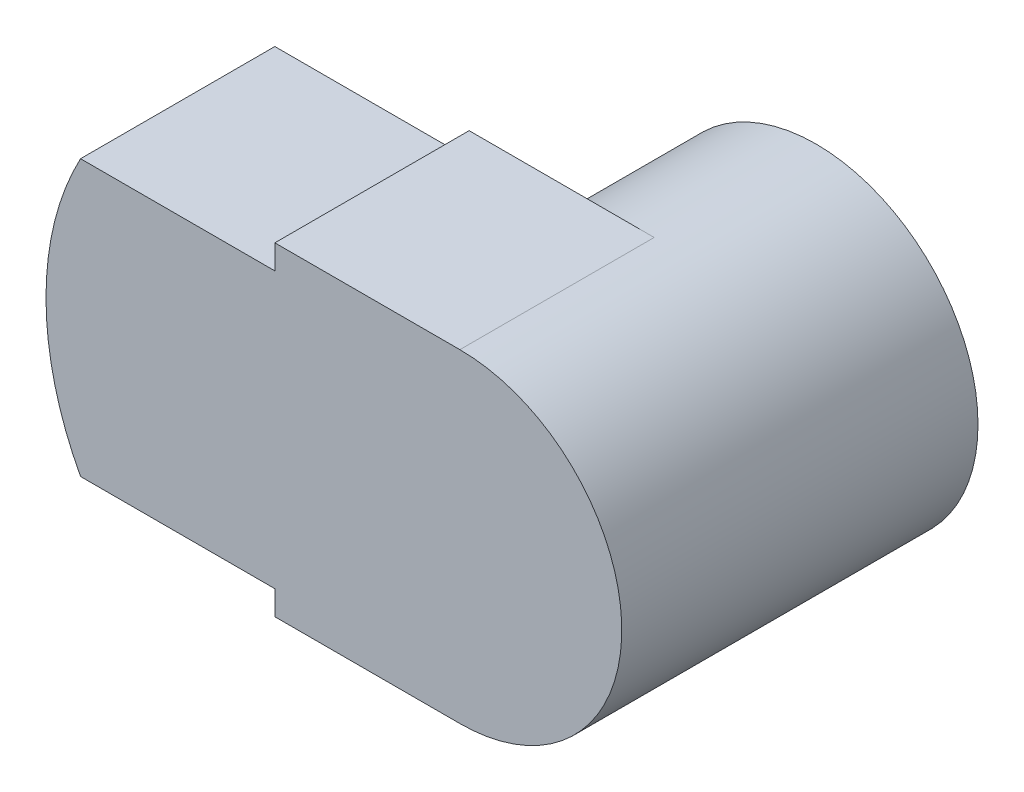
ISO-10303-21;
HEADER;
FILE_DESCRIPTION(('STEP AP214'),'2;1');
FILE_NAME('part.step','',(''),(''),'','','');
FILE_SCHEMA(('AUTOMOTIVE_DESIGN { 1 0 10303 214 1 1 1 1 }'));
ENDSEC;
DATA;
#1=APPLICATION_CONTEXT('core data for automotive mechanical design processes');
#2=APPLICATION_PROTOCOL_DEFINITION('international standard','automotive_design',2000,#1);
#3=PRODUCT_CONTEXT('',#1,'mechanical');
#4=PRODUCT('Part','Part','',(#3));
#5=PRODUCT_RELATED_PRODUCT_CATEGORY('part','',(#4));
#6=PRODUCT_DEFINITION_FORMATION('','',#4);
#7=PRODUCT_DEFINITION_CONTEXT('part definition',#1,'design');
#8=PRODUCT_DEFINITION('design','',#6,#7);
#9=PRODUCT_DEFINITION_SHAPE('','',#8);
#10=(LENGTH_UNIT() NAMED_UNIT(*) SI_UNIT(.MILLI.,.METRE.));
#11=(NAMED_UNIT(*) PLANE_ANGLE_UNIT() SI_UNIT($,.RADIAN.));
#12=(NAMED_UNIT(*) SI_UNIT($,.STERADIAN.) SOLID_ANGLE_UNIT());
#13=UNCERTAINTY_MEASURE_WITH_UNIT(LENGTH_MEASURE(1.E-05),#10,'distance_accuracy_value','');
#14=(GEOMETRIC_REPRESENTATION_CONTEXT(3) GLOBAL_UNCERTAINTY_ASSIGNED_CONTEXT((#13)) GLOBAL_UNIT_ASSIGNED_CONTEXT((#10,
#11,#12)) REPRESENTATION_CONTEXT('',''));
#15=CARTESIAN_POINT('',(0.,0.,0.));
#16=DIRECTION('',(0.,0.,1.));
#17=DIRECTION('',(1.,0.,0.));
#18=AXIS2_PLACEMENT_3D('',#15,#16,#17);
#19=CARTESIAN_POINT('',(-7.56652598149808,0.,22.));
#20=DIRECTION('',(0.,0.,-1.));
#21=DIRECTION('',(-1.,0.,0.));
#22=AXIS2_PLACEMENT_3D('',#19,#20,#21);
#23=CYLINDRICAL_SURFACE('',#22,17.9953141928283);
#24=CARTESIAN_POINT('',(-7.56652598149808,0.,10.));
#25=DIRECTION('',(0.,0.,1.));
#26=DIRECTION('',(1.,0.,0.));
#27=AXIS2_PLACEMENT_3D('',#24,#25,#26);
#28=CIRCLE('',#27,17.9953141928283);
#29=CARTESIAN_POINT('',(-23.4278415920837,8.49999999999999,10.));
#30=VERTEX_POINT('',#29);
#31=CARTESIAN_POINT('',(-23.4278415920837,-8.5,10.));
#32=VERTEX_POINT('',#31);
#33=EDGE_CURVE('E252',#30,#32,#28,.T.);
#34=ORIENTED_EDGE('',*,*,#33,.T.);
#35=DIRECTION('',(0.,0.,-1.));
#36=VECTOR('',#35,1.);
#37=CARTESIAN_POINT('',(-23.4278415920837,-8.5,22.));
#38=LINE('',#37,#36);
#39=CARTESIAN_POINT('',(-23.4278415920837,-8.5,22.));
#40=VERTEX_POINT('',#39);
#41=EDGE_CURVE('E267',#40,#32,#38,.T.);
#42=ORIENTED_EDGE('',*,*,#41,.F.);
#43=CARTESIAN_POINT('',(-7.56652598149808,0.,22.));
#44=DIRECTION('',(0.,0.,1.));
#45=DIRECTION('',(1.,0.,0.));
#46=AXIS2_PLACEMENT_3D('',#43,#44,#45);
#47=CIRCLE('',#46,17.9953141928283);
#48=CARTESIAN_POINT('',(-23.4278415920837,8.49999999999999,22.));
#49=VERTEX_POINT('',#48);
#50=EDGE_CURVE('E235',#49,#40,#47,.T.);
#51=ORIENTED_EDGE('',*,*,#50,.F.);
#52=DIRECTION('',(0.,0.,-1.));
#53=VECTOR('',#52,1.);
#54=CARTESIAN_POINT('',(-23.4278415920837,8.49999999999999,22.));
#55=LINE('',#54,#53);
#56=EDGE_CURVE('E269',#49,#30,#55,.T.);
#57=ORIENTED_EDGE('',*,*,#56,.T.);
#58=EDGE_LOOP('',(#34,#42,#51,#57));
#59=FACE_BOUND('',#58,.T.);
#60=CARTESIAN_POINT('',(-7.56652598149808,0.,11.));
#61=DIRECTION('',(0.,0.,1.));
#62=DIRECTION('',(1.,0.,0.));
#63=AXIS2_PLACEMENT_3D('',#60,#61,#62);
#64=CIRCLE('',#63,17.9953141928283);
#65=CARTESIAN_POINT('',(-23.9244394455866,7.49999999999999,11.));
#66=VERTEX_POINT('',#65);
#67=CARTESIAN_POINT('',(-23.9244394455866,-7.5,11.));
#68=VERTEX_POINT('',#67);
#69=EDGE_CURVE('E196',#66,#68,#64,.T.);
#70=ORIENTED_EDGE('',*,*,#69,.F.);
#71=DIRECTION('',(0.,0.,-1.));
#72=VECTOR('',#71,1.);
#73=CARTESIAN_POINT('',(-23.9244394455866,7.49999999999999,21.));
#74=LINE('',#73,#72);
#75=CARTESIAN_POINT('',(-23.9244394455866,7.49999999999999,21.));
#76=VERTEX_POINT('',#75);
#77=EDGE_CURVE('E204',#76,#66,#74,.T.);
#78=ORIENTED_EDGE('',*,*,#77,.F.);
#79=CARTESIAN_POINT('',(-7.56652598149808,0.,21.));
#80=DIRECTION('',(0.,0.,1.));
#81=DIRECTION('',(1.,0.,0.));
#82=AXIS2_PLACEMENT_3D('',#79,#80,#81);
#83=CIRCLE('',#82,17.9953141928283);
#84=CARTESIAN_POINT('',(-23.9244394455866,-7.5,21.));
#85=VERTEX_POINT('',#84);
#86=EDGE_CURVE('E51',#76,#85,#83,.T.);
#87=ORIENTED_EDGE('',*,*,#86,.T.);
#88=DIRECTION('',(0.,0.,-1.));
#89=VECTOR('',#88,1.);
#90=CARTESIAN_POINT('',(-23.9244394455866,-7.5,21.));
#91=LINE('',#90,#89);
#92=EDGE_CURVE('E217',#85,#68,#91,.T.);
#93=ORIENTED_EDGE('',*,*,#92,.T.);
#94=EDGE_LOOP('',(#70,#78,#87,#93));
#95=FACE_BOUND('',#94,.T.);
#96=ADVANCED_FACE('F36',(#59,#95),#23,.T.);
#97=CARTESIAN_POINT('',(0.,0.,10.));
#98=DIRECTION('',(0.,0.,-1.));
#99=DIRECTION('',(-1.,0.,0.));
#100=AXIS2_PLACEMENT_3D('',#97,#98,#99);
#101=CYLINDRICAL_SURFACE('',#100,10.);
#102=CARTESIAN_POINT('',(0.,0.,10.));
#103=DIRECTION('',(0.,0.,1.));
#104=DIRECTION('',(1.,0.,0.));
#105=AXIS2_PLACEMENT_3D('',#102,#103,#104);
#106=CIRCLE('',#105,10.);
#107=CARTESIAN_POINT('',(0.,10.,10.));
#108=VERTEX_POINT('',#107);
#109=CARTESIAN_POINT('',(0.,-10.,10.));
#110=VERTEX_POINT('',#109);
#111=EDGE_CURVE('E11',#108,#110,#106,.T.);
#112=ORIENTED_EDGE('',*,*,#111,.F.);
#113=DIRECTION('',(0.,0.,-1.));
#114=VECTOR('',#113,1.);
#115=CARTESIAN_POINT('',(0.,10.,22.));
#116=LINE('',#115,#114);
#117=CARTESIAN_POINT('',(0.,10.,22.));
#118=VERTEX_POINT('',#117);
#119=EDGE_CURVE('E278',#118,#108,#116,.T.);
#120=ORIENTED_EDGE('',*,*,#119,.F.);
#121=CARTESIAN_POINT('',(0.,0.,22.));
#122=DIRECTION('',(0.,0.,1.));
#123=DIRECTION('',(1.,0.,0.));
#124=AXIS2_PLACEMENT_3D('',#121,#122,#123);
#125=CIRCLE('',#124,10.);
#126=CARTESIAN_POINT('',(0.,-10.,22.));
#127=VERTEX_POINT('',#126);
#128=EDGE_CURVE('E225',#127,#118,#125,.T.);
#129=ORIENTED_EDGE('',*,*,#128,.F.);
#130=DIRECTION('',(0.,0.,-1.));
#131=VECTOR('',#130,1.);
#132=CARTESIAN_POINT('',(0.,-10.,22.));
#133=LINE('',#132,#131);
#134=EDGE_CURVE('E246',#127,#110,#133,.T.);
#135=ORIENTED_EDGE('',*,*,#134,.T.);
#136=EDGE_LOOP('',(#112,#120,#129,#135));
#137=FACE_BOUND('',#136,.T.);
#138=CARTESIAN_POINT('',(0.,0.,0.));
#139=DIRECTION('',(0.,0.,1.));
#140=DIRECTION('',(1.,0.,0.));
#141=AXIS2_PLACEMENT_3D('',#138,#139,#140);
#142=CIRCLE('',#141,10.);
#143=CARTESIAN_POINT('',(10.,0.,0.));
#144=VERTEX_POINT('',#143);
#145=EDGE_CURVE('E40',#144,#144,#142,.T.);
#146=ORIENTED_EDGE('',*,*,#145,.T.);
#147=EDGE_LOOP('',(#146));
#148=FACE_BOUND('',#147,.T.);
#149=ADVANCED_FACE('F38',(#137,#148),#101,.T.);
#150=CARTESIAN_POINT('',(0.,0.,0.));
#151=DIRECTION('',(0.,0.,1.));
#152=DIRECTION('',(1.,0.,0.));
#153=AXIS2_PLACEMENT_3D('',#150,#151,#152);
#154=PLANE('',#153);
#155=ORIENTED_EDGE('',*,*,#145,.F.);
#156=EDGE_LOOP('',(#155));
#157=FACE_BOUND('',#156,.T.);
#158=ADVANCED_FACE('F286',(#157),#154,.F.);
#159=CARTESIAN_POINT('',(0.,0.,10.));
#160=DIRECTION('',(0.,0.,1.));
#161=DIRECTION('',(1.,0.,0.));
#162=AXIS2_PLACEMENT_3D('',#159,#160,#161);
#163=PLANE('',#162);
#164=DIRECTION('',(-1.,0.,0.));
#165=VECTOR('',#164,1.);
#166=CARTESIAN_POINT('',(0.,10.,10.));
#167=LINE('',#166,#165);
#168=CARTESIAN_POINT('',(-11.4278415920837,10.,10.));
#169=VERTEX_POINT('',#168);
#170=EDGE_CURVE('E160',#108,#169,#167,.T.);
#171=ORIENTED_EDGE('',*,*,#170,.F.);
#172=ORIENTED_EDGE('',*,*,#111,.T.);
#173=DIRECTION('',(-1.,0.,0.));
#174=VECTOR('',#173,1.);
#175=CARTESIAN_POINT('',(0.,-10.,10.));
#176=LINE('',#175,#174);
#177=CARTESIAN_POINT('',(-11.4278415920837,-10.,10.));
#178=VERTEX_POINT('',#177);
#179=EDGE_CURVE('E229',#110,#178,#176,.T.);
#180=ORIENTED_EDGE('',*,*,#179,.T.);
#181=DIRECTION('',(0.,1.,0.));
#182=VECTOR('',#181,1.);
#183=CARTESIAN_POINT('',(-11.4278415920836,0.,10.));
#184=LINE('',#183,#182);
#185=CARTESIAN_POINT('',(-11.4278415920837,-8.5,10.));
#186=VERTEX_POINT('',#185);
#187=EDGE_CURVE('E258',#178,#186,#184,.T.);
#188=ORIENTED_EDGE('',*,*,#187,.T.);
#189=DIRECTION('',(-1.,0.,0.));
#190=VECTOR('',#189,1.);
#191=CARTESIAN_POINT('',(0.,-8.49999999999999,10.));
#192=LINE('',#191,#190);
#193=EDGE_CURVE('E255',#186,#32,#192,.T.);
#194=ORIENTED_EDGE('',*,*,#193,.T.);
#195=ORIENTED_EDGE('',*,*,#33,.F.);
#196=DIRECTION('',(-1.,0.,0.));
#197=VECTOR('',#196,1.);
#198=CARTESIAN_POINT('',(0.,8.5,10.));
#199=LINE('',#198,#197);
#200=CARTESIAN_POINT('',(-11.4278415920837,8.49999999999999,10.));
#201=VERTEX_POINT('',#200);
#202=EDGE_CURVE('E250',#201,#30,#199,.T.);
#203=ORIENTED_EDGE('',*,*,#202,.F.);
#204=DIRECTION('',(0.,-1.,0.));
#205=VECTOR('',#204,1.);
#206=CARTESIAN_POINT('',(-11.4278415920837,0.,10.));
#207=LINE('',#206,#205);
#208=EDGE_CURVE('E248',#169,#201,#207,.T.);
#209=ORIENTED_EDGE('',*,*,#208,.F.);
#210=EDGE_LOOP('',(#171,#172,#180,#188,#194,#195,#203,#209));
#211=FACE_BOUND('',#210,.T.);
#212=ADVANCED_FACE('F288',(#211),#163,.F.);
#213=CARTESIAN_POINT('',(0.,10.,22.));
#214=DIRECTION('',(0.,-1.,0.));
#215=DIRECTION('',(0.,0.,-1.));
#216=AXIS2_PLACEMENT_3D('',#213,#214,#215);
#217=PLANE('',#216);
#218=ORIENTED_EDGE('',*,*,#170,.T.);
#219=DIRECTION('',(0.,0.,-1.));
#220=VECTOR('',#219,1.);
#221=CARTESIAN_POINT('',(-11.4278415920837,10.,22.));
#222=LINE('',#221,#220);
#223=CARTESIAN_POINT('',(-11.4278415920837,10.,22.));
#224=VERTEX_POINT('',#223);
#225=EDGE_CURVE('E275',#224,#169,#222,.T.);
#226=ORIENTED_EDGE('',*,*,#225,.F.);
#227=DIRECTION('',(-1.,0.,0.));
#228=VECTOR('',#227,1.);
#229=CARTESIAN_POINT('',(0.,10.,22.));
#230=LINE('',#229,#228);
#231=EDGE_CURVE('E228',#118,#224,#230,.T.);
#232=ORIENTED_EDGE('',*,*,#231,.F.);
#233=ORIENTED_EDGE('',*,*,#119,.T.);
#234=EDGE_LOOP('',(#218,#226,#232,#233));
#235=FACE_BOUND('',#234,.T.);
#236=ADVANCED_FACE('F293',(#235),#217,.F.);
#237=CARTESIAN_POINT('',(-11.4278415920837,0.,22.));
#238=DIRECTION('',(1.,0.,0.));
#239=DIRECTION('',(0.,1.,0.));
#240=AXIS2_PLACEMENT_3D('',#237,#238,#239);
#241=PLANE('',#240);
#242=ORIENTED_EDGE('',*,*,#208,.T.);
#243=DIRECTION('',(0.,0.,-1.));
#244=VECTOR('',#243,1.);
#245=CARTESIAN_POINT('',(-11.4278415920837,8.49999999999999,22.));
#246=LINE('',#245,#244);
#247=CARTESIAN_POINT('',(-11.4278415920837,8.49999999999999,22.));
#248=VERTEX_POINT('',#247);
#249=EDGE_CURVE('E272',#248,#201,#246,.T.);
#250=ORIENTED_EDGE('',*,*,#249,.F.);
#251=DIRECTION('',(0.,-1.,0.));
#252=VECTOR('',#251,1.);
#253=CARTESIAN_POINT('',(-11.4278415920837,0.,22.));
#254=LINE('',#253,#252);
#255=EDGE_CURVE('E231',#224,#248,#254,.T.);
#256=ORIENTED_EDGE('',*,*,#255,.F.);
#257=ORIENTED_EDGE('',*,*,#225,.T.);
#258=EDGE_LOOP('',(#242,#250,#256,#257));
#259=FACE_BOUND('',#258,.T.);
#260=ADVANCED_FACE('F310',(#259),#241,.F.);
#261=CARTESIAN_POINT('',(0.,8.5,22.));
#262=DIRECTION('',(0.,-1.,0.));
#263=DIRECTION('',(1.,0.,0.));
#264=AXIS2_PLACEMENT_3D('',#261,#262,#263);
#265=PLANE('',#264);
#266=ORIENTED_EDGE('',*,*,#202,.T.);
#267=ORIENTED_EDGE('',*,*,#56,.F.);
#268=DIRECTION('',(-1.,0.,0.));
#269=VECTOR('',#268,1.);
#270=CARTESIAN_POINT('',(0.,8.5,22.));
#271=LINE('',#270,#269);
#272=EDGE_CURVE('E233',#248,#49,#271,.T.);
#273=ORIENTED_EDGE('',*,*,#272,.F.);
#274=ORIENTED_EDGE('',*,*,#249,.T.);
#275=EDGE_LOOP('',(#266,#267,#273,#274));
#276=FACE_BOUND('',#275,.T.);
#277=ADVANCED_FACE('F307',(#276),#265,.F.);
#278=CARTESIAN_POINT('',(0.,-8.49999999999999,22.));
#279=DIRECTION('',(0.,-1.,0.));
#280=DIRECTION('',(1.,0.,0.));
#281=AXIS2_PLACEMENT_3D('',#278,#279,#280);
#282=PLANE('',#281);
#283=ORIENTED_EDGE('',*,*,#193,.F.);
#284=DIRECTION('',(0.,0.,-1.));
#285=VECTOR('',#284,1.);
#286=CARTESIAN_POINT('',(-11.4278415920837,-8.5,22.));
#287=LINE('',#286,#285);
#288=CARTESIAN_POINT('',(-11.4278415920837,-8.5,22.));
#289=VERTEX_POINT('',#288);
#290=EDGE_CURVE('E265',#289,#186,#287,.T.);
#291=ORIENTED_EDGE('',*,*,#290,.F.);
#292=DIRECTION('',(-1.,0.,0.));
#293=VECTOR('',#292,1.);
#294=CARTESIAN_POINT('',(0.,-8.49999999999999,22.));
#295=LINE('',#294,#293);
#296=EDGE_CURVE('E237',#289,#40,#295,.T.);
#297=ORIENTED_EDGE('',*,*,#296,.T.);
#298=ORIENTED_EDGE('',*,*,#41,.T.);
#299=EDGE_LOOP('',(#283,#291,#297,#298));
#300=FACE_BOUND('',#299,.T.);
#301=ADVANCED_FACE('F305',(#300),#282,.T.);
#302=CARTESIAN_POINT('',(-11.4278415920836,0.,22.));
#303=DIRECTION('',(-1.,0.,0.));
#304=DIRECTION('',(0.,-1.,0.));
#305=AXIS2_PLACEMENT_3D('',#302,#303,#304);
#306=PLANE('',#305);
#307=ORIENTED_EDGE('',*,*,#187,.F.);
#308=DIRECTION('',(0.,0.,-1.));
#309=VECTOR('',#308,1.);
#310=CARTESIAN_POINT('',(-11.4278415920837,-10.,22.));
#311=LINE('',#310,#309);
#312=CARTESIAN_POINT('',(-11.4278415920837,-10.,22.));
#313=VERTEX_POINT('',#312);
#314=EDGE_CURVE('E263',#313,#178,#311,.T.);
#315=ORIENTED_EDGE('',*,*,#314,.F.);
#316=DIRECTION('',(0.,1.,0.));
#317=VECTOR('',#316,1.);
#318=CARTESIAN_POINT('',(-11.4278415920836,0.,22.));
#319=LINE('',#318,#317);
#320=EDGE_CURVE('E240',#313,#289,#319,.T.);
#321=ORIENTED_EDGE('',*,*,#320,.T.);
#322=ORIENTED_EDGE('',*,*,#290,.T.);
#323=EDGE_LOOP('',(#307,#315,#321,#322));
#324=FACE_BOUND('',#323,.T.);
#325=ADVANCED_FACE('F339',(#324),#306,.T.);
#326=CARTESIAN_POINT('',(0.,-10.,22.));
#327=DIRECTION('',(0.,-1.,0.));
#328=DIRECTION('',(0.,0.,-1.));
#329=AXIS2_PLACEMENT_3D('',#326,#327,#328);
#330=PLANE('',#329);
#331=ORIENTED_EDGE('',*,*,#179,.F.);
#332=ORIENTED_EDGE('',*,*,#134,.F.);
#333=DIRECTION('',(-1.,0.,0.));
#334=VECTOR('',#333,1.);
#335=CARTESIAN_POINT('',(0.,-10.,22.));
#336=LINE('',#335,#334);
#337=EDGE_CURVE('E243',#127,#313,#336,.T.);
#338=ORIENTED_EDGE('',*,*,#337,.T.);
#339=ORIENTED_EDGE('',*,*,#314,.T.);
#340=EDGE_LOOP('',(#331,#332,#338,#339));
#341=FACE_BOUND('',#340,.T.);
#342=ADVANCED_FACE('F335',(#341),#330,.T.);
#343=CARTESIAN_POINT('',(0.,0.,22.));
#344=DIRECTION('',(0.,0.,1.));
#345=DIRECTION('',(1.,0.,0.));
#346=AXIS2_PLACEMENT_3D('',#343,#344,#345);
#347=PLANE('',#346);
#348=ORIENTED_EDGE('',*,*,#128,.T.);
#349=ORIENTED_EDGE('',*,*,#231,.T.);
#350=ORIENTED_EDGE('',*,*,#255,.T.);
#351=ORIENTED_EDGE('',*,*,#272,.T.);
#352=ORIENTED_EDGE('',*,*,#50,.T.);
#353=ORIENTED_EDGE('',*,*,#296,.F.);
#354=ORIENTED_EDGE('',*,*,#320,.F.);
#355=ORIENTED_EDGE('',*,*,#337,.F.);
#356=EDGE_LOOP('',(#348,#349,#350,#351,#352,#353,#354,#355));
#357=FACE_BOUND('',#356,.T.);
#358=ADVANCED_FACE('F329',(#357),#347,.T.);
#359=CARTESIAN_POINT('',(0.,0.,10.));
#360=DIRECTION('',(0.,0.,-1.));
#361=DIRECTION('',(-1.,0.,0.));
#362=AXIS2_PLACEMENT_3D('',#359,#360,#361);
#363=CYLINDRICAL_SURFACE('',#362,9.);
#364=CARTESIAN_POINT('',(0.,0.,11.));
#365=DIRECTION('',(0.,0.,1.));
#366=DIRECTION('',(1.,0.,0.));
#367=AXIS2_PLACEMENT_3D('',#364,#365,#366);
#368=CIRCLE('',#367,9.);
#369=CARTESIAN_POINT('',(0.,9.,11.));
#370=VERTEX_POINT('',#369);
#371=CARTESIAN_POINT('',(0.,-9.,11.));
#372=VERTEX_POINT('',#371);
#373=EDGE_CURVE('E149',#370,#372,#368,.T.);
#374=ORIENTED_EDGE('',*,*,#373,.T.);
#375=DIRECTION('',(0.,0.,-1.));
#376=VECTOR('',#375,1.);
#377=CARTESIAN_POINT('',(0.,-9.,10.));
#378=LINE('',#377,#376);
#379=CARTESIAN_POINT('',(0.,-9.,21.));
#380=VERTEX_POINT('',#379);
#381=EDGE_CURVE('E185',#380,#372,#378,.T.);
#382=ORIENTED_EDGE('',*,*,#381,.F.);
#383=CARTESIAN_POINT('',(0.,0.,21.));
#384=DIRECTION('',(0.,0.,1.));
#385=DIRECTION('',(1.,0.,0.));
#386=AXIS2_PLACEMENT_3D('',#383,#384,#385);
#387=CIRCLE('',#386,9.);
#388=CARTESIAN_POINT('',(0.,9.,21.));
#389=VERTEX_POINT('',#388);
#390=EDGE_CURVE('E176',#380,#389,#387,.T.);
#391=ORIENTED_EDGE('',*,*,#390,.T.);
#392=DIRECTION('',(0.,0.,-1.));
#393=VECTOR('',#392,1.);
#394=CARTESIAN_POINT('',(0.,9.,22.));
#395=LINE('',#394,#393);
#396=EDGE_CURVE('E166',#389,#370,#395,.T.);
#397=ORIENTED_EDGE('',*,*,#396,.T.);
#398=EDGE_LOOP('',(#374,#382,#391,#397));
#399=FACE_BOUND('',#398,.T.);
#400=CARTESIAN_POINT('',(0.,0.,0.999999999999999));
#401=DIRECTION('',(0.,0.,1.));
#402=DIRECTION('',(1.,0.,0.));
#403=AXIS2_PLACEMENT_3D('',#400,#401,#402);
#404=CIRCLE('',#403,9.);
#405=CARTESIAN_POINT('',(9.,0.,0.999999999999999));
#406=VERTEX_POINT('',#405);
#407=EDGE_CURVE('E161',#406,#406,#404,.T.);
#408=ORIENTED_EDGE('',*,*,#407,.F.);
#409=EDGE_LOOP('',(#408));
#410=FACE_BOUND('',#409,.T.);
#411=ADVANCED_FACE('F173',(#399,#410),#363,.F.);
#412=CARTESIAN_POINT('',(0.,0.,1.));
#413=DIRECTION('',(0.,0.,1.));
#414=DIRECTION('',(1.,0.,0.));
#415=AXIS2_PLACEMENT_3D('',#412,#413,#414);
#416=PLANE('',#415);
#417=ORIENTED_EDGE('',*,*,#407,.T.);
#418=EDGE_LOOP('',(#417));
#419=FACE_BOUND('',#418,.T.);
#420=ADVANCED_FACE('F379',(#419),#416,.T.);
#421=CARTESIAN_POINT('',(0.,0.,11.));
#422=DIRECTION('',(0.,0.,1.));
#423=DIRECTION('',(1.,0.,0.));
#424=AXIS2_PLACEMENT_3D('',#421,#422,#423);
#425=PLANE('',#424);
#426=DIRECTION('',(-1.,0.,0.));
#427=VECTOR('',#426,1.);
#428=CARTESIAN_POINT('',(0.,9.,11.));
#429=LINE('',#428,#427);
#430=CARTESIAN_POINT('',(-10.4278415920837,9.,11.));
#431=VERTEX_POINT('',#430);
#432=EDGE_CURVE('E152',#370,#431,#429,.T.);
#433=ORIENTED_EDGE('',*,*,#432,.T.);
#434=DIRECTION('',(0.,-1.,0.));
#435=VECTOR('',#434,1.);
#436=CARTESIAN_POINT('',(-10.4278415920837,0.,11.));
#437=LINE('',#436,#435);
#438=CARTESIAN_POINT('',(-10.4278415920837,7.49999999999999,11.));
#439=VERTEX_POINT('',#438);
#440=EDGE_CURVE('E170',#431,#439,#437,.T.);
#441=ORIENTED_EDGE('',*,*,#440,.T.);
#442=DIRECTION('',(-1.,0.,0.));
#443=VECTOR('',#442,1.);
#444=CARTESIAN_POINT('',(0.,7.5,11.));
#445=LINE('',#444,#443);
#446=EDGE_CURVE('E197',#439,#66,#445,.T.);
#447=ORIENTED_EDGE('',*,*,#446,.T.);
#448=ORIENTED_EDGE('',*,*,#69,.T.);
#449=DIRECTION('',(-1.,0.,0.));
#450=VECTOR('',#449,1.);
#451=CARTESIAN_POINT('',(0.,-7.49999999999999,11.));
#452=LINE('',#451,#450);
#453=CARTESIAN_POINT('',(-10.4278415920837,-7.5,11.));
#454=VERTEX_POINT('',#453);
#455=EDGE_CURVE('E193',#454,#68,#452,.T.);
#456=ORIENTED_EDGE('',*,*,#455,.F.);
#457=DIRECTION('',(0.,1.,0.));
#458=VECTOR('',#457,1.);
#459=CARTESIAN_POINT('',(-10.4278415920836,0.,11.));
#460=LINE('',#459,#458);
#461=CARTESIAN_POINT('',(-10.4278415920837,-9.,11.));
#462=VERTEX_POINT('',#461);
#463=EDGE_CURVE('E190',#462,#454,#460,.T.);
#464=ORIENTED_EDGE('',*,*,#463,.F.);
#465=DIRECTION('',(-1.,0.,0.));
#466=VECTOR('',#465,1.);
#467=CARTESIAN_POINT('',(0.,-9.,11.));
#468=LINE('',#467,#466);
#469=EDGE_CURVE('E156',#372,#462,#468,.T.);
#470=ORIENTED_EDGE('',*,*,#469,.F.);
#471=ORIENTED_EDGE('',*,*,#373,.F.);
#472=EDGE_LOOP('',(#433,#441,#447,#448,#456,#464,#470,#471));
#473=FACE_BOUND('',#472,.T.);
#474=ADVANCED_FACE('F151',(#473),#425,.T.);
#475=CARTESIAN_POINT('',(0.,9.,22.));
#476=DIRECTION('',(0.,-1.,0.));
#477=DIRECTION('',(0.,0.,-1.));
#478=AXIS2_PLACEMENT_3D('',#475,#476,#477);
#479=PLANE('',#478);
#480=ORIENTED_EDGE('',*,*,#432,.F.);
#481=ORIENTED_EDGE('',*,*,#396,.F.);
#482=DIRECTION('',(-1.,0.,0.));
#483=VECTOR('',#482,1.);
#484=CARTESIAN_POINT('',(0.,9.,21.));
#485=LINE('',#484,#483);
#486=CARTESIAN_POINT('',(-10.4278415920837,9.,21.));
#487=VERTEX_POINT('',#486);
#488=EDGE_CURVE('E184',#389,#487,#485,.T.);
#489=ORIENTED_EDGE('',*,*,#488,.T.);
#490=DIRECTION('',(0.,0.,-1.));
#491=VECTOR('',#490,1.);
#492=CARTESIAN_POINT('',(-10.4278415920837,9.,22.));
#493=LINE('',#492,#491);
#494=EDGE_CURVE('E168',#487,#431,#493,.T.);
#495=ORIENTED_EDGE('',*,*,#494,.T.);
#496=EDGE_LOOP('',(#480,#481,#489,#495));
#497=FACE_BOUND('',#496,.T.);
#498=ADVANCED_FACE('F165',(#497),#479,.T.);
#499=CARTESIAN_POINT('',(-10.4278415920837,0.,22.));
#500=DIRECTION('',(1.,0.,0.));
#501=DIRECTION('',(0.,1.,0.));
#502=AXIS2_PLACEMENT_3D('',#499,#500,#501);
#503=PLANE('',#502);
#504=ORIENTED_EDGE('',*,*,#440,.F.);
#505=ORIENTED_EDGE('',*,*,#494,.F.);
#506=DIRECTION('',(0.,-1.,0.));
#507=VECTOR('',#506,1.);
#508=CARTESIAN_POINT('',(-10.4278415920837,0.,21.));
#509=LINE('',#508,#507);
#510=CARTESIAN_POINT('',(-10.4278415920837,7.49999999999999,21.));
#511=VERTEX_POINT('',#510);
#512=EDGE_CURVE('E201',#487,#511,#509,.T.);
#513=ORIENTED_EDGE('',*,*,#512,.T.);
#514=DIRECTION('',(0.,0.,-1.));
#515=VECTOR('',#514,1.);
#516=CARTESIAN_POINT('',(-10.4278415920837,7.49999999999999,22.));
#517=LINE('',#516,#515);
#518=EDGE_CURVE('E180',#511,#439,#517,.T.);
#519=ORIENTED_EDGE('',*,*,#518,.T.);
#520=EDGE_LOOP('',(#504,#505,#513,#519));
#521=FACE_BOUND('',#520,.T.);
#522=ADVANCED_FACE('F370',(#521),#503,.T.);
#523=CARTESIAN_POINT('',(0.,7.5,22.));
#524=DIRECTION('',(0.,-1.,0.));
#525=DIRECTION('',(1.,0.,0.));
#526=AXIS2_PLACEMENT_3D('',#523,#524,#525);
#527=PLANE('',#526);
#528=ORIENTED_EDGE('',*,*,#446,.F.);
#529=ORIENTED_EDGE('',*,*,#518,.F.);
#530=DIRECTION('',(-1.,0.,0.));
#531=VECTOR('',#530,1.);
#532=CARTESIAN_POINT('',(0.,7.5,21.));
#533=LINE('',#532,#531);
#534=EDGE_CURVE('E206',#511,#76,#533,.T.);
#535=ORIENTED_EDGE('',*,*,#534,.T.);
#536=ORIENTED_EDGE('',*,*,#77,.T.);
#537=EDGE_LOOP('',(#528,#529,#535,#536));
#538=FACE_BOUND('',#537,.T.);
#539=ADVANCED_FACE('F366',(#538),#527,.T.);
#540=CARTESIAN_POINT('',(0.,-7.49999999999999,22.));
#541=DIRECTION('',(0.,-1.,0.));
#542=DIRECTION('',(1.,0.,0.));
#543=AXIS2_PLACEMENT_3D('',#540,#541,#542);
#544=PLANE('',#543);
#545=ORIENTED_EDGE('',*,*,#455,.T.);
#546=ORIENTED_EDGE('',*,*,#92,.F.);
#547=DIRECTION('',(-1.,0.,0.));
#548=VECTOR('',#547,1.);
#549=CARTESIAN_POINT('',(0.,-7.49999999999999,21.));
#550=LINE('',#549,#548);
#551=CARTESIAN_POINT('',(-10.4278415920837,-7.5,21.));
#552=VERTEX_POINT('',#551);
#553=EDGE_CURVE('E208',#552,#85,#550,.T.);
#554=ORIENTED_EDGE('',*,*,#553,.F.);
#555=DIRECTION('',(0.,0.,-1.));
#556=VECTOR('',#555,1.);
#557=CARTESIAN_POINT('',(-10.4278415920837,-7.5,22.));
#558=LINE('',#557,#556);
#559=EDGE_CURVE('E215',#552,#454,#558,.T.);
#560=ORIENTED_EDGE('',*,*,#559,.T.);
#561=EDGE_LOOP('',(#545,#546,#554,#560));
#562=FACE_BOUND('',#561,.T.);
#563=ADVANCED_FACE('F362',(#562),#544,.F.);
#564=CARTESIAN_POINT('',(-10.4278415920836,0.,22.));
#565=DIRECTION('',(-1.,0.,0.));
#566=DIRECTION('',(0.,-1.,0.));
#567=AXIS2_PLACEMENT_3D('',#564,#565,#566);
#568=PLANE('',#567);
#569=ORIENTED_EDGE('',*,*,#463,.T.);
#570=ORIENTED_EDGE('',*,*,#559,.F.);
#571=DIRECTION('',(0.,1.,0.));
#572=VECTOR('',#571,1.);
#573=CARTESIAN_POINT('',(-10.4278415920836,0.,21.));
#574=LINE('',#573,#572);
#575=CARTESIAN_POINT('',(-10.4278415920837,-9.,21.));
#576=VERTEX_POINT('',#575);
#577=EDGE_CURVE('E210',#576,#552,#574,.T.);
#578=ORIENTED_EDGE('',*,*,#577,.F.);
#579=DIRECTION('',(0.,0.,-1.));
#580=VECTOR('',#579,1.);
#581=CARTESIAN_POINT('',(-10.4278415920837,-9.,22.));
#582=LINE('',#581,#580);
#583=EDGE_CURVE('E186',#576,#462,#582,.T.);
#584=ORIENTED_EDGE('',*,*,#583,.T.);
#585=EDGE_LOOP('',(#569,#570,#578,#584));
#586=FACE_BOUND('',#585,.T.);
#587=ADVANCED_FACE('F358',(#586),#568,.F.);
#588=CARTESIAN_POINT('',(0.,-9.,22.));
#589=DIRECTION('',(0.,-1.,0.));
#590=DIRECTION('',(0.,0.,-1.));
#591=AXIS2_PLACEMENT_3D('',#588,#589,#590);
#592=PLANE('',#591);
#593=ORIENTED_EDGE('',*,*,#469,.T.);
#594=ORIENTED_EDGE('',*,*,#583,.F.);
#595=DIRECTION('',(-1.,0.,0.));
#596=VECTOR('',#595,1.);
#597=CARTESIAN_POINT('',(0.,-9.,21.));
#598=LINE('',#597,#596);
#599=EDGE_CURVE('E187',#380,#576,#598,.T.);
#600=ORIENTED_EDGE('',*,*,#599,.F.);
#601=ORIENTED_EDGE('',*,*,#381,.T.);
#602=EDGE_LOOP('',(#593,#594,#600,#601));
#603=FACE_BOUND('',#602,.T.);
#604=ADVANCED_FACE('F355',(#603),#592,.F.);
#605=CARTESIAN_POINT('',(0.,0.,21.));
#606=DIRECTION('',(0.,0.,1.));
#607=DIRECTION('',(1.,0.,0.));
#608=AXIS2_PLACEMENT_3D('',#605,#606,#607);
#609=PLANE('',#608);
#610=ORIENTED_EDGE('',*,*,#390,.F.);
#611=ORIENTED_EDGE('',*,*,#599,.T.);
#612=ORIENTED_EDGE('',*,*,#577,.T.);
#613=ORIENTED_EDGE('',*,*,#553,.T.);
#614=ORIENTED_EDGE('',*,*,#86,.F.);
#615=ORIENTED_EDGE('',*,*,#534,.F.);
#616=ORIENTED_EDGE('',*,*,#512,.F.);
#617=ORIENTED_EDGE('',*,*,#488,.F.);
#618=EDGE_LOOP('',(#610,#611,#612,#613,#614,#615,#616,#617));
#619=FACE_BOUND('',#618,.T.);
#620=ADVANCED_FACE('F352',(#619),#609,.F.);
#621=CLOSED_SHELL('',(#96,#149,#158,#212,#236,#260,#277,#301,#325,#342,#358,#411,#420,#474,#498,
#522,#539,#563,#587,#604,#620));
#622=MANIFOLD_SOLID_BREP('B2',#621);
#623=ADVANCED_BREP_SHAPE_REPRESENTATION('',(#18,#622),#14);
#624=SHAPE_DEFINITION_REPRESENTATION(#9,#623);
ENDSEC;
END-ISO-10303-21;
